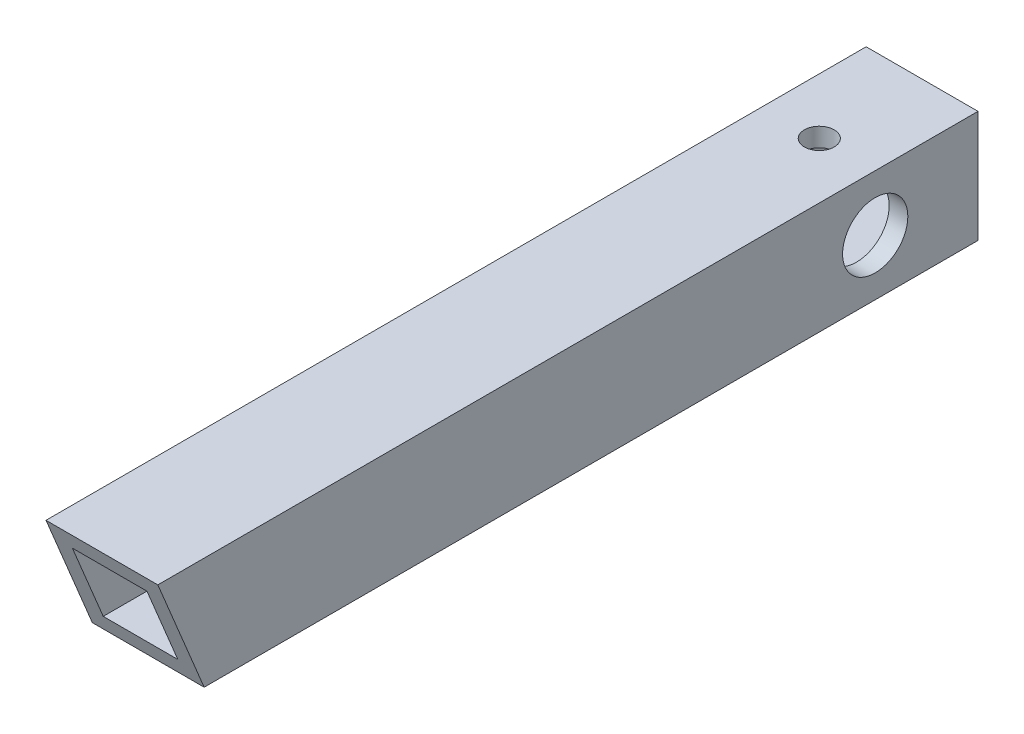
ISO-10303-21;
HEADER;
FILE_DESCRIPTION(('STEP AP214'),'2;1');
FILE_NAME('part.step','',(''),(''),'','','');
FILE_SCHEMA(('AUTOMOTIVE_DESIGN { 1 0 10303 214 1 1 1 1 }'));
ENDSEC;
DATA;
#1=APPLICATION_CONTEXT('core data for automotive mechanical design processes');
#2=APPLICATION_PROTOCOL_DEFINITION('international standard','automotive_design',2000,#1);
#3=PRODUCT_CONTEXT('',#1,'mechanical');
#4=PRODUCT('Part','Part','',(#3));
#5=PRODUCT_RELATED_PRODUCT_CATEGORY('part','',(#4));
#6=PRODUCT_DEFINITION_FORMATION('','',#4);
#7=PRODUCT_DEFINITION_CONTEXT('part definition',#1,'design');
#8=PRODUCT_DEFINITION('design','',#6,#7);
#9=PRODUCT_DEFINITION_SHAPE('','',#8);
#10=(LENGTH_UNIT() NAMED_UNIT(*) SI_UNIT(.MILLI.,.METRE.));
#11=(NAMED_UNIT(*) PLANE_ANGLE_UNIT() SI_UNIT($,.RADIAN.));
#12=(NAMED_UNIT(*) SI_UNIT($,.STERADIAN.) SOLID_ANGLE_UNIT());
#13=UNCERTAINTY_MEASURE_WITH_UNIT(LENGTH_MEASURE(1.E-05),#10,'distance_accuracy_value','');
#14=(GEOMETRIC_REPRESENTATION_CONTEXT(3) GLOBAL_UNCERTAINTY_ASSIGNED_CONTEXT((#13)) GLOBAL_UNIT_ASSIGNED_CONTEXT((#10,
#11,#12)) REPRESENTATION_CONTEXT('',''));
#15=CARTESIAN_POINT('',(0.,0.,0.));
#16=DIRECTION('',(0.,0.,1.));
#17=DIRECTION('',(1.,0.,0.));
#18=AXIS2_PLACEMENT_3D('',#15,#16,#17);
#19=CARTESIAN_POINT('',(0.,0.,-69.85));
#20=DIRECTION('',(0.,0.,-1.));
#21=DIRECTION('',(-1.,0.,0.));
#22=AXIS2_PLACEMENT_3D('',#19,#20,#21);
#23=PLANE('',#22);
#24=DIRECTION('',(0.,1.,0.));
#25=VECTOR('',#24,1.);
#26=CARTESIAN_POINT('',(9.525,-9.525,-69.85));
#27=LINE('',#26,#25);
#28=CARTESIAN_POINT('',(9.525,-9.525,-69.85));
#29=VERTEX_POINT('',#28);
#30=CARTESIAN_POINT('',(9.525,9.525,-69.85));
#31=VERTEX_POINT('',#30);
#32=EDGE_CURVE('E172',#29,#31,#27,.T.);
#33=ORIENTED_EDGE('',*,*,#32,.F.);
#34=DIRECTION('',(1.,0.,0.));
#35=VECTOR('',#34,1.);
#36=CARTESIAN_POINT('',(-9.525,-9.525,-69.85));
#37=LINE('',#36,#35);
#38=CARTESIAN_POINT('',(-9.525,-9.525,-69.85));
#39=VERTEX_POINT('',#38);
#40=EDGE_CURVE('E109',#39,#29,#37,.T.);
#41=ORIENTED_EDGE('',*,*,#40,.F.);
#42=DIRECTION('',(0.,-1.,0.));
#43=VECTOR('',#42,1.);
#44=CARTESIAN_POINT('',(-9.525,-9.525,-69.85));
#45=LINE('',#44,#43);
#46=CARTESIAN_POINT('',(-9.525,9.525,-69.85));
#47=VERTEX_POINT('',#46);
#48=EDGE_CURVE('E177',#47,#39,#45,.T.);
#49=ORIENTED_EDGE('',*,*,#48,.F.);
#50=DIRECTION('',(-1.,0.,0.));
#51=VECTOR('',#50,1.);
#52=CARTESIAN_POINT('',(-9.525,9.525,-69.85));
#53=LINE('',#52,#51);
#54=EDGE_CURVE('E122',#31,#47,#53,.T.);
#55=ORIENTED_EDGE('',*,*,#54,.F.);
#56=EDGE_LOOP('',(#33,#41,#49,#55));
#57=FACE_BOUND('',#56,.T.);
#58=DIRECTION('',(1.,0.,0.));
#59=VECTOR('',#58,1.);
#60=CARTESIAN_POINT('',(-6.35,-6.34999999999999,-69.85));
#61=LINE('',#60,#59);
#62=CARTESIAN_POINT('',(-6.35,-6.34999999999999,-69.85));
#63=VERTEX_POINT('',#62);
#64=CARTESIAN_POINT('',(6.34999999999999,-6.34999999999999,-69.85));
#65=VERTEX_POINT('',#64);
#66=EDGE_CURVE('E162',#63,#65,#61,.T.);
#67=ORIENTED_EDGE('',*,*,#66,.T.);
#68=DIRECTION('',(0.,1.,0.));
#69=VECTOR('',#68,1.);
#70=CARTESIAN_POINT('',(6.34999999999999,-6.34999999999999,-69.85));
#71=LINE('',#70,#69);
#72=CARTESIAN_POINT('',(6.34999999999999,6.35,-69.85));
#73=VERTEX_POINT('',#72);
#74=EDGE_CURVE('E153',#65,#73,#71,.T.);
#75=ORIENTED_EDGE('',*,*,#74,.T.);
#76=DIRECTION('',(-1.,0.,0.));
#77=VECTOR('',#76,1.);
#78=CARTESIAN_POINT('',(-6.35,6.35,-69.85));
#79=LINE('',#78,#77);
#80=CARTESIAN_POINT('',(-6.35,6.35,-69.85));
#81=VERTEX_POINT('',#80);
#82=EDGE_CURVE('E156',#73,#81,#79,.T.);
#83=ORIENTED_EDGE('',*,*,#82,.T.);
#84=DIRECTION('',(0.,-1.,0.));
#85=VECTOR('',#84,1.);
#86=CARTESIAN_POINT('',(-6.35,-6.34999999999999,-69.85));
#87=LINE('',#86,#85);
#88=EDGE_CURVE('E159',#81,#63,#87,.T.);
#89=ORIENTED_EDGE('',*,*,#88,.T.);
#90=EDGE_LOOP('',(#67,#75,#83,#89));
#91=FACE_BOUND('',#90,.T.);
#92=ADVANCED_FACE('F36',(#57,#91),#23,.T.);
#93=CARTESIAN_POINT('',(9.525,-9.525,69.85));
#94=DIRECTION('',(-1.,0.,0.));
#95=DIRECTION('',(0.,0.,1.));
#96=AXIS2_PLACEMENT_3D('',#93,#94,#95);
#97=PLANE('',#96);
#98=CARTESIAN_POINT('',(9.525,0.,-52.3407683632073));
#99=DIRECTION('',(1.,0.,0.));
#100=DIRECTION('',(0.,0.,-1.));
#101=AXIS2_PLACEMENT_3D('',#98,#99,#100);
#102=CIRCLE('',#101,5.55625);
#103=CARTESIAN_POINT('',(9.525,0.,-57.8970183632073));
#104=VERTEX_POINT('',#103);
#105=EDGE_CURVE('E136',#104,#104,#102,.T.);
#106=ORIENTED_EDGE('',*,*,#105,.F.);
#107=EDGE_LOOP('',(#106));
#108=FACE_BOUND('',#107,.T.);
#109=DIRECTION('',(0.,0.,-1.));
#110=VECTOR('',#109,1.);
#111=CARTESIAN_POINT('',(9.525,9.525,69.85));
#112=LINE('',#111,#110);
#113=CARTESIAN_POINT('',(9.525,9.525,69.85));
#114=VERTEX_POINT('',#113);
#115=EDGE_CURVE('E45',#114,#31,#112,.T.);
#116=ORIENTED_EDGE('',*,*,#115,.F.);
#117=DIRECTION('',(0.,0.923879532511289,0.382683432365084));
#118=VECTOR('',#117,1.);
#119=CARTESIAN_POINT('',(9.525,9.525,69.85));
#120=LINE('',#119,#118);
#121=CARTESIAN_POINT('',(9.525,-9.525,61.9592316367927));
#122=VERTEX_POINT('',#121);
#123=EDGE_CURVE('E103',#122,#114,#120,.T.);
#124=ORIENTED_EDGE('',*,*,#123,.F.);
#125=DIRECTION('',(0.,0.,-1.));
#126=VECTOR('',#125,1.);
#127=CARTESIAN_POINT('',(9.525,-9.525,69.85));
#128=LINE('',#127,#126);
#129=EDGE_CURVE('E108',#122,#29,#128,.T.);
#130=ORIENTED_EDGE('',*,*,#129,.T.);
#131=ORIENTED_EDGE('',*,*,#32,.T.);
#132=EDGE_LOOP('',(#116,#124,#130,#131));
#133=FACE_BOUND('',#132,.T.);
#134=ADVANCED_FACE('F38',(#108,#133),#97,.F.);
#135=CARTESIAN_POINT('',(-9.525,9.525,69.85));
#136=DIRECTION('',(0.,-1.,0.));
#137=DIRECTION('',(0.,0.,-1.));
#138=AXIS2_PLACEMENT_3D('',#135,#136,#137);
#139=PLANE('',#138);
#140=CARTESIAN_POINT('',(0.,9.525,-52.3407683632073));
#141=DIRECTION('',(0.,1.,0.));
#142=DIRECTION('',(0.,0.,1.));
#143=AXIS2_PLACEMENT_3D('',#140,#141,#142);
#144=CIRCLE('',#143,2.54);
#145=CARTESIAN_POINT('',(0.,9.525,-49.8007683632073));
#146=VERTEX_POINT('',#145);
#147=EDGE_CURVE('E244',#146,#146,#144,.T.);
#148=ORIENTED_EDGE('',*,*,#147,.F.);
#149=EDGE_LOOP('',(#148));
#150=FACE_BOUND('',#149,.T.);
#151=ORIENTED_EDGE('',*,*,#54,.T.);
#152=DIRECTION('',(0.,0.,-1.));
#153=VECTOR('',#152,1.);
#154=CARTESIAN_POINT('',(-9.525,9.525,69.85));
#155=LINE('',#154,#153);
#156=CARTESIAN_POINT('',(-9.52500000000001,9.525,69.85));
#157=VERTEX_POINT('',#156);
#158=EDGE_CURVE('E116',#157,#47,#155,.T.);
#159=ORIENTED_EDGE('',*,*,#158,.F.);
#160=DIRECTION('',(-1.,0.,0.));
#161=VECTOR('',#160,1.);
#162=CARTESIAN_POINT('',(-9.525,9.525,69.85));
#163=LINE('',#162,#161);
#164=EDGE_CURVE('E100',#114,#157,#163,.T.);
#165=ORIENTED_EDGE('',*,*,#164,.F.);
#166=ORIENTED_EDGE('',*,*,#115,.T.);
#167=EDGE_LOOP('',(#151,#159,#165,#166));
#168=FACE_BOUND('',#167,.T.);
#169=ADVANCED_FACE('F121',(#150,#168),#139,.F.);
#170=CARTESIAN_POINT('',(-9.525,-9.525,69.85));
#171=DIRECTION('',(1.,0.,0.));
#172=DIRECTION('',(0.,1.,0.));
#173=AXIS2_PLACEMENT_3D('',#170,#171,#172);
#174=PLANE('',#173);
#175=CARTESIAN_POINT('',(-9.52500000000001,0.,-52.3407683632073));
#176=DIRECTION('',(1.,0.,0.));
#177=DIRECTION('',(0.,0.,-1.));
#178=AXIS2_PLACEMENT_3D('',#175,#176,#177);
#179=CIRCLE('',#178,5.55625);
#180=CARTESIAN_POINT('',(-9.52500000000001,0.,-57.8970183632073));
#181=VERTEX_POINT('',#180);
#182=EDGE_CURVE('E130',#181,#181,#179,.T.);
#183=ORIENTED_EDGE('',*,*,#182,.T.);
#184=EDGE_LOOP('',(#183));
#185=FACE_BOUND('',#184,.T.);
#186=DIRECTION('',(0.,0.,-1.));
#187=VECTOR('',#186,1.);
#188=CARTESIAN_POINT('',(-9.525,-9.525,69.85));
#189=LINE('',#188,#187);
#190=CARTESIAN_POINT('',(-9.525,-9.525,61.9592316367927));
#191=VERTEX_POINT('',#190);
#192=EDGE_CURVE('E118',#191,#39,#189,.T.);
#193=ORIENTED_EDGE('',*,*,#192,.F.);
#194=DIRECTION('',(0.,0.923879532511289,0.382683432365084));
#195=VECTOR('',#194,1.);
#196=CARTESIAN_POINT('',(-9.52500000000001,9.525,69.85));
#197=LINE('',#196,#195);
#198=EDGE_CURVE('E53',#191,#157,#197,.T.);
#199=ORIENTED_EDGE('',*,*,#198,.T.);
#200=ORIENTED_EDGE('',*,*,#158,.T.);
#201=ORIENTED_EDGE('',*,*,#48,.T.);
#202=EDGE_LOOP('',(#193,#199,#200,#201));
#203=FACE_BOUND('',#202,.T.);
#204=ADVANCED_FACE('F114',(#185,#203),#174,.F.);
#205=CARTESIAN_POINT('',(-9.525,-9.525,69.85));
#206=DIRECTION('',(0.,1.,0.));
#207=DIRECTION('',(0.,0.,1.));
#208=AXIS2_PLACEMENT_3D('',#205,#206,#207);
#209=PLANE('',#208);
#210=CARTESIAN_POINT('',(0.,-9.525,-52.3407683632073));
#211=DIRECTION('',(0.,1.,0.));
#212=DIRECTION('',(0.,0.,1.));
#213=AXIS2_PLACEMENT_3D('',#210,#211,#212);
#214=CIRCLE('',#213,2.54);
#215=CARTESIAN_POINT('',(0.,-9.525,-49.8007683632073));
#216=VERTEX_POINT('',#215);
#217=EDGE_CURVE('E246',#216,#216,#214,.T.);
#218=ORIENTED_EDGE('',*,*,#217,.T.);
#219=EDGE_LOOP('',(#218));
#220=FACE_BOUND('',#219,.T.);
#221=ORIENTED_EDGE('',*,*,#129,.F.);
#222=DIRECTION('',(1.,0.,0.));
#223=VECTOR('',#222,1.);
#224=CARTESIAN_POINT('',(-9.52500000000001,-9.525,61.9592316367927));
#225=LINE('',#224,#223);
#226=EDGE_CURVE('E119',#191,#122,#225,.T.);
#227=ORIENTED_EDGE('',*,*,#226,.F.);
#228=ORIENTED_EDGE('',*,*,#192,.T.);
#229=ORIENTED_EDGE('',*,*,#40,.T.);
#230=EDGE_LOOP('',(#221,#227,#228,#229));
#231=FACE_BOUND('',#230,.T.);
#232=ADVANCED_FACE('F185',(#220,#231),#209,.F.);
#233=CARTESIAN_POINT('',(6.34999999999999,-6.34999999999999,69.85));
#234=DIRECTION('',(-1.,0.,0.));
#235=DIRECTION('',(0.,0.,1.));
#236=AXIS2_PLACEMENT_3D('',#233,#234,#235);
#237=PLANE('',#236);
#238=CARTESIAN_POINT('',(6.34999999999999,0.,-52.3407683632073));
#239=DIRECTION('',(-1.,0.,0.));
#240=DIRECTION('',(0.,0.,1.));
#241=AXIS2_PLACEMENT_3D('',#238,#239,#240);
#242=CIRCLE('',#241,5.55625);
#243=CARTESIAN_POINT('',(6.34999999999999,0.,-46.7845183632073));
#244=VERTEX_POINT('',#243);
#245=EDGE_CURVE('E129',#244,#244,#242,.T.);
#246=ORIENTED_EDGE('',*,*,#245,.F.);
#247=EDGE_LOOP('',(#246));
#248=FACE_BOUND('',#247,.T.);
#249=DIRECTION('',(0.,-0.923879532511289,-0.382683432365084));
#250=VECTOR('',#249,1.);
#251=CARTESIAN_POINT('',(6.34999999999999,-4.02516007566828,64.2373399243318));
#252=LINE('',#251,#250);
#253=CARTESIAN_POINT('',(6.34999999999999,6.35,68.5348719394654));
#254=VERTEX_POINT('',#253);
#255=CARTESIAN_POINT('',(6.34999999999999,-6.34999999999999,63.2743596973272));
#256=VERTEX_POINT('',#255);
#257=EDGE_CURVE('E60',#254,#256,#252,.T.);
#258=ORIENTED_EDGE('',*,*,#257,.F.);
#259=DIRECTION('',(0.,0.,-1.));
#260=VECTOR('',#259,1.);
#261=CARTESIAN_POINT('',(6.34999999999999,6.35,69.85));
#262=LINE('',#261,#260);
#263=EDGE_CURVE('E171',#254,#73,#262,.T.);
#264=ORIENTED_EDGE('',*,*,#263,.T.);
#265=ORIENTED_EDGE('',*,*,#74,.F.);
#266=DIRECTION('',(0.,0.,-1.));
#267=VECTOR('',#266,1.);
#268=CARTESIAN_POINT('',(6.34999999999999,-6.34999999999999,69.85));
#269=LINE('',#268,#267);
#270=EDGE_CURVE('E165',#256,#65,#269,.T.);
#271=ORIENTED_EDGE('',*,*,#270,.F.);
#272=EDGE_LOOP('',(#258,#264,#265,#271));
#273=FACE_BOUND('',#272,.T.);
#274=ADVANCED_FACE('F198',(#248,#273),#237,.T.);
#275=CARTESIAN_POINT('',(-6.35,6.35,69.85));
#276=DIRECTION('',(0.,-1.,0.));
#277=DIRECTION('',(0.,0.,-1.));
#278=AXIS2_PLACEMENT_3D('',#275,#276,#277);
#279=PLANE('',#278);
#280=CARTESIAN_POINT('',(0.,6.35,-52.3407683632073));
#281=DIRECTION('',(0.,-1.,0.));
#282=DIRECTION('',(0.,0.,-1.));
#283=AXIS2_PLACEMENT_3D('',#280,#281,#282);
#284=CIRCLE('',#283,2.54);
#285=CARTESIAN_POINT('',(0.,6.35,-54.8807683632073));
#286=VERTEX_POINT('',#285);
#287=EDGE_CURVE('E141',#286,#286,#284,.T.);
#288=ORIENTED_EDGE('',*,*,#287,.F.);
#289=EDGE_LOOP('',(#288));
#290=FACE_BOUND('',#289,.T.);
#291=DIRECTION('',(1.,0.,0.));
#292=VECTOR('',#291,1.);
#293=CARTESIAN_POINT('',(-6.35,6.35,68.5348719394654));
#294=LINE('',#293,#292);
#295=CARTESIAN_POINT('',(-6.35,6.35,68.5348719394654));
#296=VERTEX_POINT('',#295);
#297=EDGE_CURVE('E150',#296,#254,#294,.T.);
#298=ORIENTED_EDGE('',*,*,#297,.F.);
#299=DIRECTION('',(0.,0.,-1.));
#300=VECTOR('',#299,1.);
#301=CARTESIAN_POINT('',(-6.35,6.35,69.85));
#302=LINE('',#301,#300);
#303=EDGE_CURVE('E169',#296,#81,#302,.T.);
#304=ORIENTED_EDGE('',*,*,#303,.T.);
#305=ORIENTED_EDGE('',*,*,#82,.F.);
#306=ORIENTED_EDGE('',*,*,#263,.F.);
#307=EDGE_LOOP('',(#298,#304,#305,#306));
#308=FACE_BOUND('',#307,.T.);
#309=ADVANCED_FACE('F203',(#290,#308),#279,.T.);
#310=CARTESIAN_POINT('',(-6.35,-6.34999999999999,69.85));
#311=DIRECTION('',(1.,0.,0.));
#312=DIRECTION('',(0.,0.,-1.));
#313=AXIS2_PLACEMENT_3D('',#310,#311,#312);
#314=PLANE('',#313);
#315=CARTESIAN_POINT('',(-6.35,0.,-52.3407683632073));
#316=DIRECTION('',(1.,0.,0.));
#317=DIRECTION('',(0.,0.,-1.));
#318=AXIS2_PLACEMENT_3D('',#315,#316,#317);
#319=CIRCLE('',#318,5.55625);
#320=CARTESIAN_POINT('',(-6.35,0.,-57.8970183632073));
#321=VERTEX_POINT('',#320);
#322=EDGE_CURVE('E127',#321,#321,#319,.T.);
#323=ORIENTED_EDGE('',*,*,#322,.F.);
#324=EDGE_LOOP('',(#323));
#325=FACE_BOUND('',#324,.T.);
#326=DIRECTION('',(0.,0.923879532511289,0.382683432365084));
#327=VECTOR('',#326,1.);
#328=CARTESIAN_POINT('',(-6.35,-4.02516007566828,64.2373399243318));
#329=LINE('',#328,#327);
#330=CARTESIAN_POINT('',(-6.35,-6.34999999999999,63.2743596973272));
#331=VERTEX_POINT('',#330);
#332=EDGE_CURVE('E148',#331,#296,#329,.T.);
#333=ORIENTED_EDGE('',*,*,#332,.F.);
#334=DIRECTION('',(0.,0.,-1.));
#335=VECTOR('',#334,1.);
#336=CARTESIAN_POINT('',(-6.35,-6.34999999999999,69.85));
#337=LINE('',#336,#335);
#338=EDGE_CURVE('E167',#331,#63,#337,.T.);
#339=ORIENTED_EDGE('',*,*,#338,.T.);
#340=ORIENTED_EDGE('',*,*,#88,.F.);
#341=ORIENTED_EDGE('',*,*,#303,.F.);
#342=EDGE_LOOP('',(#333,#339,#340,#341));
#343=FACE_BOUND('',#342,.T.);
#344=ADVANCED_FACE('F207',(#325,#343),#314,.T.);
#345=CARTESIAN_POINT('',(-6.35,-6.34999999999999,69.85));
#346=DIRECTION('',(0.,1.,0.));
#347=DIRECTION('',(0.,0.,1.));
#348=AXIS2_PLACEMENT_3D('',#345,#346,#347);
#349=PLANE('',#348);
#350=CARTESIAN_POINT('',(0.,-6.34999999999999,-52.3407683632073));
#351=DIRECTION('',(0.,1.,0.));
#352=DIRECTION('',(0.,0.,1.));
#353=AXIS2_PLACEMENT_3D('',#350,#351,#352);
#354=CIRCLE('',#353,2.54);
#355=CARTESIAN_POINT('',(0.,-6.34999999999999,-49.8007683632073));
#356=VERTEX_POINT('',#355);
#357=EDGE_CURVE('E40',#356,#356,#354,.T.);
#358=ORIENTED_EDGE('',*,*,#357,.F.);
#359=EDGE_LOOP('',(#358));
#360=FACE_BOUND('',#359,.T.);
#361=DIRECTION('',(-1.,0.,0.));
#362=VECTOR('',#361,1.);
#363=CARTESIAN_POINT('',(-6.35,-6.34999999999999,63.2743596973272));
#364=LINE('',#363,#362);
#365=EDGE_CURVE('E11',#256,#331,#364,.T.);
#366=ORIENTED_EDGE('',*,*,#365,.F.);
#367=ORIENTED_EDGE('',*,*,#270,.T.);
#368=ORIENTED_EDGE('',*,*,#66,.F.);
#369=ORIENTED_EDGE('',*,*,#338,.F.);
#370=EDGE_LOOP('',(#366,#367,#368,#369));
#371=FACE_BOUND('',#370,.T.);
#372=ADVANCED_FACE('F195',(#360,#371),#349,.T.);
#373=CARTESIAN_POINT('',(-9.52500000000001,9.525,69.85));
#374=DIRECTION('',(0.,0.382683432365084,-0.923879532511289));
#375=DIRECTION('',(0.,0.923879532511289,0.382683432365084));
#376=AXIS2_PLACEMENT_3D('',#373,#374,#375);
#377=PLANE('',#376);
#378=ORIENTED_EDGE('',*,*,#257,.T.);
#379=ORIENTED_EDGE('',*,*,#365,.T.);
#380=ORIENTED_EDGE('',*,*,#332,.T.);
#381=ORIENTED_EDGE('',*,*,#297,.T.);
#382=EDGE_LOOP('',(#378,#379,#380,#381));
#383=FACE_BOUND('',#382,.T.);
#384=ORIENTED_EDGE('',*,*,#123,.T.);
#385=ORIENTED_EDGE('',*,*,#164,.T.);
#386=ORIENTED_EDGE('',*,*,#198,.F.);
#387=ORIENTED_EDGE('',*,*,#226,.T.);
#388=EDGE_LOOP('',(#384,#385,#386,#387));
#389=FACE_BOUND('',#388,.T.);
#390=ADVANCED_FACE('F101',(#383,#389),#377,.F.);
#391=CARTESIAN_POINT('',(-9.52500000000001,0.,-52.3407683632073));
#392=DIRECTION('',(1.,0.,0.));
#393=DIRECTION('',(0.,0.,-1.));
#394=AXIS2_PLACEMENT_3D('',#391,#392,#393);
#395=CYLINDRICAL_SURFACE('',#394,5.55625);
#396=ORIENTED_EDGE('',*,*,#322,.T.);
#397=EDGE_LOOP('',(#396));
#398=FACE_BOUND('',#397,.T.);
#399=ORIENTED_EDGE('',*,*,#182,.F.);
#400=EDGE_LOOP('',(#399));
#401=FACE_BOUND('',#400,.T.);
#402=ADVANCED_FACE('F209',(#398,#401),#395,.F.);
#403=ORIENTED_EDGE('',*,*,#245,.T.);
#404=EDGE_LOOP('',(#403));
#405=FACE_BOUND('',#404,.T.);
#406=ORIENTED_EDGE('',*,*,#105,.T.);
#407=EDGE_LOOP('',(#406));
#408=FACE_BOUND('',#407,.T.);
#409=ADVANCED_FACE('F215',(#405,#408),#395,.F.);
#410=CARTESIAN_POINT('',(0.,-9.525,-52.3407683632073));
#411=DIRECTION('',(0.,1.,0.));
#412=DIRECTION('',(0.,0.,1.));
#413=AXIS2_PLACEMENT_3D('',#410,#411,#412);
#414=CYLINDRICAL_SURFACE('',#413,2.54);
#415=ORIENTED_EDGE('',*,*,#357,.T.);
#416=EDGE_LOOP('',(#415));
#417=FACE_BOUND('',#416,.T.);
#418=ORIENTED_EDGE('',*,*,#217,.F.);
#419=EDGE_LOOP('',(#418));
#420=FACE_BOUND('',#419,.T.);
#421=ADVANCED_FACE('F258',(#417,#420),#414,.F.);
#422=ORIENTED_EDGE('',*,*,#287,.T.);
#423=EDGE_LOOP('',(#422));
#424=FACE_BOUND('',#423,.T.);
#425=ORIENTED_EDGE('',*,*,#147,.T.);
#426=EDGE_LOOP('',(#425));
#427=FACE_BOUND('',#426,.T.);
#428=ADVANCED_FACE('F256',(#424,#427),#414,.F.);
#429=CLOSED_SHELL('',(#92,#134,#169,#204,#232,#274,#309,#344,#372,#390,#402,#409,#421,#428));
#430=MANIFOLD_SOLID_BREP('B2',#429);
#431=ADVANCED_BREP_SHAPE_REPRESENTATION('',(#18,#430),#14);
#432=SHAPE_DEFINITION_REPRESENTATION(#9,#431);
ENDSEC;
END-ISO-10303-21;
